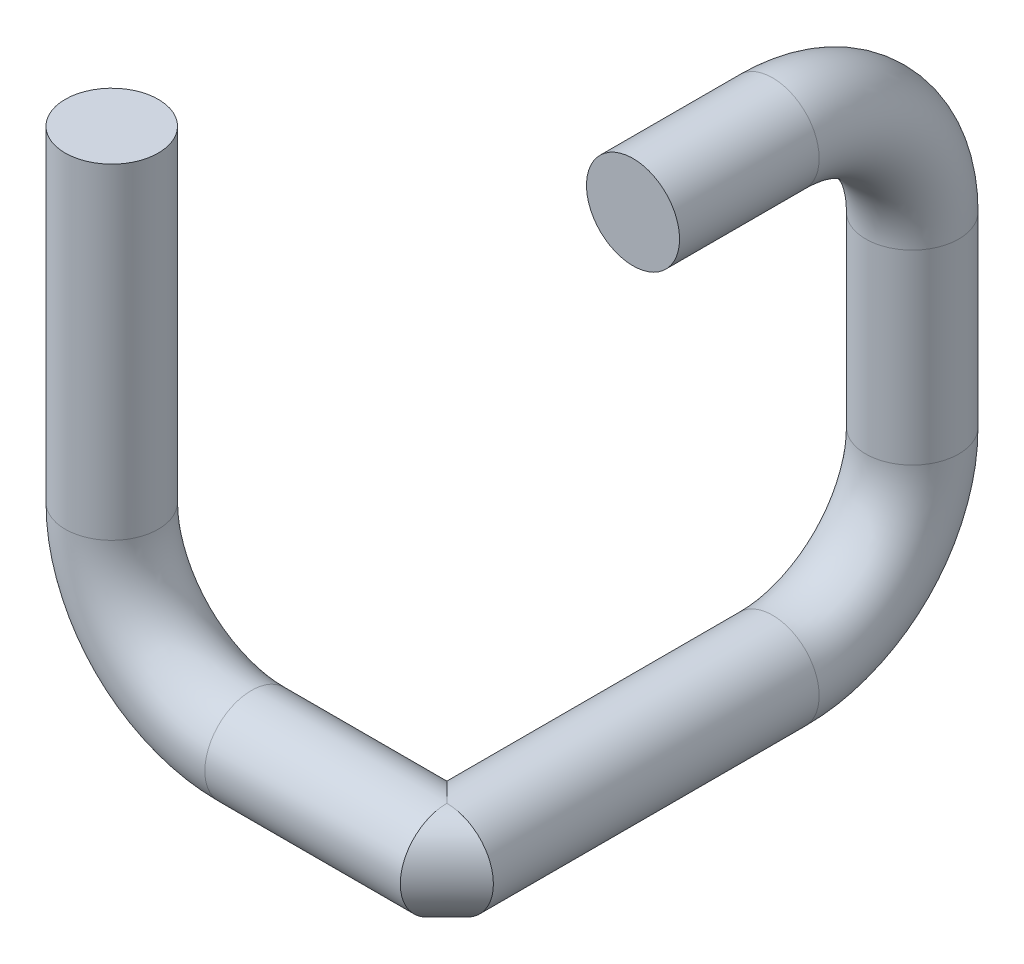
ISO-10303-21;
HEADER;
FILE_DESCRIPTION(('STEP AP214'),'2;1');
FILE_NAME('part.step','',(''),(''),'','','');
FILE_SCHEMA(('AUTOMOTIVE_DESIGN { 1 0 10303 214 1 1 1 1 }'));
ENDSEC;
DATA;
#1=APPLICATION_CONTEXT('core data for automotive mechanical design processes');
#2=APPLICATION_PROTOCOL_DEFINITION('international standard','automotive_design',2000,#1);
#3=PRODUCT_CONTEXT('',#1,'mechanical');
#4=PRODUCT('Part','Part','',(#3));
#5=PRODUCT_RELATED_PRODUCT_CATEGORY('part','',(#4));
#6=PRODUCT_DEFINITION_FORMATION('','',#4);
#7=PRODUCT_DEFINITION_CONTEXT('part definition',#1,'design');
#8=PRODUCT_DEFINITION('design','',#6,#7);
#9=PRODUCT_DEFINITION_SHAPE('','',#8);
#10=(LENGTH_UNIT() NAMED_UNIT(*) SI_UNIT(.MILLI.,.METRE.));
#11=(NAMED_UNIT(*) PLANE_ANGLE_UNIT() SI_UNIT($,.RADIAN.));
#12=(NAMED_UNIT(*) SI_UNIT($,.STERADIAN.) SOLID_ANGLE_UNIT());
#13=UNCERTAINTY_MEASURE_WITH_UNIT(LENGTH_MEASURE(1.E-05),#10,'distance_accuracy_value','');
#14=(GEOMETRIC_REPRESENTATION_CONTEXT(3) GLOBAL_UNCERTAINTY_ASSIGNED_CONTEXT((#13)) GLOBAL_UNIT_ASSIGNED_CONTEXT((#10,
#11,#12)) REPRESENTATION_CONTEXT('',''));
#15=CARTESIAN_POINT('',(0.,0.,0.));
#16=DIRECTION('',(0.,0.,1.));
#17=DIRECTION('',(1.,0.,0.));
#18=AXIS2_PLACEMENT_3D('',#15,#16,#17);
#19=CARTESIAN_POINT('',(-36.1538461538461,26.8269230769231,0.));
#20=DIRECTION('',(0.,1.,0.));
#21=DIRECTION('',(0.,0.,1.));
#22=AXIS2_PLACEMENT_3D('',#19,#20,#21);
#23=PLANE('',#22);
#24=CARTESIAN_POINT('',(-36.1538461538461,26.8269230769231,0.));
#25=DIRECTION('',(0.,1.,0.));
#26=DIRECTION('',(0.,0.,1.));
#27=AXIS2_PLACEMENT_3D('',#24,#25,#26);
#28=CIRCLE('',#27,5.);
#29=CARTESIAN_POINT('',(-36.1538461538461,26.8269230769231,5.));
#30=VERTEX_POINT('',#29);
#31=EDGE_CURVE('E170',#30,#30,#28,.T.);
#32=ORIENTED_EDGE('',*,*,#31,.T.);
#33=EDGE_LOOP('',(#32));
#34=FACE_BOUND('',#33,.T.);
#35=ADVANCED_FACE('F39',(#34),#23,.T.);
#36=CARTESIAN_POINT('',(-36.1538461538461,26.8269230769231,0.));
#37=DIRECTION('',(0.,-1.,0.));
#38=DIRECTION('',(0.,0.,-1.));
#39=AXIS2_PLACEMENT_3D('',#36,#37,#38);
#40=CYLINDRICAL_SURFACE('',#39,5.);
#41=CARTESIAN_POINT('',(-36.1538461538461,-8.17307692307681,0.));
#42=DIRECTION('',(0.,1.,0.));
#43=DIRECTION('',(0.,0.,1.));
#44=AXIS2_PLACEMENT_3D('',#41,#42,#43);
#45=CIRCLE('',#44,5.);
#46=CARTESIAN_POINT('',(-41.1538461538463,-8.17307692307678,0.));
#47=VERTEX_POINT('',#46);
#48=EDGE_CURVE('E174',#47,#47,#45,.T.);
#49=ORIENTED_EDGE('',*,*,#48,.T.);
#50=EDGE_LOOP('',(#49));
#51=FACE_BOUND('',#50,.T.);
#52=ORIENTED_EDGE('',*,*,#31,.F.);
#53=EDGE_LOOP('',(#52));
#54=FACE_BOUND('',#53,.T.);
#55=ADVANCED_FACE('F92',(#51,#54),#40,.T.);
#56=CARTESIAN_POINT('',(-21.1538461538461,-8.17307692307692,0.));
#57=DIRECTION('',(0.,0.,1.));
#58=DIRECTION('',(1.,0.,0.));
#59=AXIS2_PLACEMENT_3D('',#56,#57,#58);
#60=TOROIDAL_SURFACE('',#59,15.0000000000002,5.);
#61=CARTESIAN_POINT('',(-21.153846153846,-23.1730769230769,0.));
#62=DIRECTION('',(-1.,0.,0.));
#63=DIRECTION('',(0.,0.,1.));
#64=AXIS2_PLACEMENT_3D('',#61,#62,#63);
#65=CIRCLE('',#64,5.);
#66=CARTESIAN_POINT('',(-21.153846153846,-28.1730769230771,0.));
#67=VERTEX_POINT('',#66);
#68=EDGE_CURVE('E73',#67,#67,#65,.T.);
#69=CARTESIAN_POINT('',(-21.1538461538461,-8.17307692307692,0.));
#70=DIRECTION('',(0.,0.,1.));
#71=DIRECTION('',(1.,0.,0.));
#72=AXIS2_PLACEMENT_3D('',#69,#70,#71);
#73=CIRCLE('',#72,20.0000000000002);
#74=EDGE_CURVE('',#47,#67,#73,.T.);
#75=ORIENTED_EDGE('',*,*,#48,.F.);
#76=ORIENTED_EDGE('',*,*,#68,.T.);
#77=ORIENTED_EDGE('',*,*,#74,.T.);
#78=ORIENTED_EDGE('',*,*,#74,.F.);
#79=EDGE_LOOP('',(#75,#77,#76,#78));
#80=FACE_BOUND('',#79,.T.);
#81=ADVANCED_FACE('F89',(#80),#60,.T.);
#82=CARTESIAN_POINT('',(-21.153846153846,-23.1730769230769,0.));
#83=DIRECTION('',(1.,0.,0.));
#84=DIRECTION('',(0.,0.,-1.));
#85=AXIS2_PLACEMENT_3D('',#82,#83,#84);
#86=CYLINDRICAL_SURFACE('',#85,5.);
#87=CARTESIAN_POINT('',(-0.15384615384615,-23.1730769230769,0.));
#88=DIRECTION('',(-1.,0.,0.));
#89=DIRECTION('',(0.,0.,1.));
#90=AXIS2_PLACEMENT_3D('',#87,#88,#89);
#91=CIRCLE('',#90,5.);
#92=CARTESIAN_POINT('',(-0.15384615384615,-28.1730769230769,0.));
#93=VERTEX_POINT('',#92);
#94=CARTESIAN_POINT('',(-0.15384615384615,-18.1730769230769,0.));
#95=VERTEX_POINT('',#94);
#96=EDGE_CURVE('E42',#93,#95,#91,.T.);
#97=ORIENTED_EDGE('',*,*,#96,.T.);
#98=CARTESIAN_POINT('',(-0.15384615384615,-23.1730769230769,0.));
#99=DIRECTION('',(0.707106781186547,0.,-0.707106781186547));
#100=DIRECTION('',(0.707106781186547,0.,0.707106781186547));
#101=AXIS2_PLACEMENT_3D('',#98,#99,#100);
#102=ELLIPSE('',#101,7.07106781186548,5.);
#103=EDGE_CURVE('E11',#95,#93,#102,.F.);
#104=ORIENTED_EDGE('',*,*,#103,.T.);
#105=EDGE_LOOP('',(#97,#104));
#106=FACE_BOUND('',#105,.T.);
#107=ORIENTED_EDGE('',*,*,#68,.F.);
#108=EDGE_LOOP('',(#107));
#109=FACE_BOUND('',#108,.T.);
#110=ADVANCED_FACE('F70',(#106,#109),#86,.T.);
#111=CARTESIAN_POINT('',(-0.15384615384615,-23.1730769230769,0.));
#112=DIRECTION('',(0.,0.,-1.));
#113=DIRECTION('',(-1.,0.,0.));
#114=AXIS2_PLACEMENT_3D('',#111,#112,#113);
#115=CYLINDRICAL_SURFACE('',#114,5.);
#116=CARTESIAN_POINT('',(-0.15384615384615,-23.1730769230769,-34.9999999999999));
#117=DIRECTION('',(0.,0.,-1.));
#118=DIRECTION('',(1.,0.,0.));
#119=AXIS2_PLACEMENT_3D('',#116,#117,#118);
#120=CIRCLE('',#119,5.);
#121=CARTESIAN_POINT('',(-0.15384615384615,-28.1730769230769,-34.9999999999999));
#122=VERTEX_POINT('',#121);
#123=EDGE_CURVE('E64',#122,#122,#120,.T.);
#124=ORIENTED_EDGE('',*,*,#123,.F.);
#125=EDGE_LOOP('',(#124));
#126=FACE_BOUND('',#125,.T.);
#127=ORIENTED_EDGE('',*,*,#103,.F.);
#128=CARTESIAN_POINT('',(-0.15384615384615,-23.1730769230769,0.));
#129=DIRECTION('',(0.,0.,-1.));
#130=DIRECTION('',(1.,0.,0.));
#131=AXIS2_PLACEMENT_3D('',#128,#129,#130);
#132=CIRCLE('',#131,5.);
#133=EDGE_CURVE('E57',#95,#93,#132,.T.);
#134=ORIENTED_EDGE('',*,*,#133,.T.);
#135=EDGE_LOOP('',(#127,#134));
#136=FACE_BOUND('',#135,.T.);
#137=ADVANCED_FACE('F67',(#126,#136),#115,.T.);
#138=CARTESIAN_POINT('',(-0.15384615384615,26.8269230769231,-20.));
#139=DIRECTION('',(0.,0.,1.));
#140=DIRECTION('',(1.,0.,0.));
#141=AXIS2_PLACEMENT_3D('',#138,#139,#140);
#142=PLANE('',#141);
#143=CARTESIAN_POINT('',(-0.15384615384615,26.8269230769231,-20.));
#144=DIRECTION('',(0.,0.,1.));
#145=DIRECTION('',(1.,0.,0.));
#146=AXIS2_PLACEMENT_3D('',#143,#144,#145);
#147=CIRCLE('',#146,5.);
#148=CARTESIAN_POINT('',(4.84615384615385,26.8269230769231,-20.));
#149=VERTEX_POINT('',#148);
#150=EDGE_CURVE('E166',#149,#149,#147,.T.);
#151=ORIENTED_EDGE('',*,*,#150,.T.);
#152=EDGE_LOOP('',(#151));
#153=FACE_BOUND('',#152,.T.);
#154=ADVANCED_FACE('F97',(#153),#142,.T.);
#155=CARTESIAN_POINT('',(-0.15384615384615,-8.17307692307692,-35.));
#156=DIRECTION('',(1.,0.,0.));
#157=DIRECTION('',(0.,0.,-1.));
#158=AXIS2_PLACEMENT_3D('',#155,#156,#157);
#159=TOROIDAL_SURFACE('',#158,15.,5.);
#160=CARTESIAN_POINT('',(-0.15384615384615,-8.17307692307682,-50.));
#161=DIRECTION('',(0.,1.,0.));
#162=DIRECTION('',(1.,0.,0.));
#163=AXIS2_PLACEMENT_3D('',#160,#161,#162);
#164=CIRCLE('',#163,5.);
#165=CARTESIAN_POINT('',(-0.15384615384615,-8.17307692307678,-55.));
#166=VERTEX_POINT('',#165);
#167=EDGE_CURVE('E154',#166,#166,#164,.T.);
#168=CARTESIAN_POINT('',(-0.15384615384615,-8.17307692307692,-35.));
#169=DIRECTION('',(1.,0.,0.));
#170=DIRECTION('',(0.,0.,-1.));
#171=AXIS2_PLACEMENT_3D('',#168,#169,#170);
#172=CIRCLE('',#171,20.);
#173=EDGE_CURVE('',#122,#166,#172,.T.);
#174=ORIENTED_EDGE('',*,*,#123,.T.);
#175=ORIENTED_EDGE('',*,*,#167,.F.);
#176=ORIENTED_EDGE('',*,*,#173,.T.);
#177=ORIENTED_EDGE('',*,*,#173,.F.);
#178=EDGE_LOOP('',(#174,#176,#175,#177));
#179=FACE_BOUND('',#178,.T.);
#180=ADVANCED_FACE('F100',(#179),#159,.T.);
#181=CARTESIAN_POINT('',(-0.15384615384615,-8.17307692307681,-50.));
#182=DIRECTION('',(0.,1.,0.));
#183=DIRECTION('',(0.,0.,1.));
#184=AXIS2_PLACEMENT_3D('',#181,#182,#183);
#185=CYLINDRICAL_SURFACE('',#184,5.);
#186=CARTESIAN_POINT('',(-0.15384615384615,11.8269230769231,-50.));
#187=DIRECTION('',(0.,1.,0.));
#188=DIRECTION('',(1.,0.,0.));
#189=AXIS2_PLACEMENT_3D('',#186,#187,#188);
#190=CIRCLE('',#189,5.);
#191=CARTESIAN_POINT('',(-0.15384615384615,11.8269230769231,-55.));
#192=VERTEX_POINT('',#191);
#193=EDGE_CURVE('E158',#192,#192,#190,.T.);
#194=ORIENTED_EDGE('',*,*,#193,.F.);
#195=EDGE_LOOP('',(#194));
#196=FACE_BOUND('',#195,.T.);
#197=ORIENTED_EDGE('',*,*,#167,.T.);
#198=EDGE_LOOP('',(#197));
#199=FACE_BOUND('',#198,.T.);
#200=ADVANCED_FACE('F109',(#196,#199),#185,.T.);
#201=CARTESIAN_POINT('',(-0.15384615384615,11.8269230769231,-35.));
#202=DIRECTION('',(1.,0.,0.));
#203=DIRECTION('',(0.,0.,-1.));
#204=AXIS2_PLACEMENT_3D('',#201,#202,#203);
#205=TOROIDAL_SURFACE('',#204,15.,5.);
#206=CARTESIAN_POINT('',(-0.15384615384615,26.8269230769231,-35.));
#207=DIRECTION('',(0.,0.,1.));
#208=DIRECTION('',(1.,0.,0.));
#209=AXIS2_PLACEMENT_3D('',#206,#207,#208);
#210=CIRCLE('',#209,5.);
#211=CARTESIAN_POINT('',(-0.15384615384615,31.8269230769231,-35.));
#212=VERTEX_POINT('',#211);
#213=EDGE_CURVE('E162',#212,#212,#210,.T.);
#214=CARTESIAN_POINT('',(-0.15384615384615,11.8269230769231,-35.));
#215=DIRECTION('',(1.,0.,0.));
#216=DIRECTION('',(0.,0.,-1.));
#217=AXIS2_PLACEMENT_3D('',#214,#215,#216);
#218=CIRCLE('',#217,20.);
#219=EDGE_CURVE('',#192,#212,#218,.T.);
#220=ORIENTED_EDGE('',*,*,#193,.T.);
#221=ORIENTED_EDGE('',*,*,#213,.F.);
#222=ORIENTED_EDGE('',*,*,#219,.T.);
#223=ORIENTED_EDGE('',*,*,#219,.F.);
#224=EDGE_LOOP('',(#220,#222,#221,#223));
#225=FACE_BOUND('',#224,.T.);
#226=ADVANCED_FACE('F105',(#225),#205,.T.);
#227=CARTESIAN_POINT('',(-0.15384615384615,26.8269230769231,-35.));
#228=DIRECTION('',(0.,0.,1.));
#229=DIRECTION('',(0.,-1.,0.));
#230=AXIS2_PLACEMENT_3D('',#227,#228,#229);
#231=CYLINDRICAL_SURFACE('',#230,5.);
#232=ORIENTED_EDGE('',*,*,#150,.F.);
#233=EDGE_LOOP('',(#232));
#234=FACE_BOUND('',#233,.T.);
#235=ORIENTED_EDGE('',*,*,#213,.T.);
#236=EDGE_LOOP('',(#235));
#237=FACE_BOUND('',#236,.T.);
#238=ADVANCED_FACE('F102',(#234,#237),#231,.T.);
#239=CARTESIAN_POINT('',(-0.15384615384615,-18.1730769230769,0.));
#240=CARTESIAN_POINT('',(-0.153846153846151,-18.1730769230769,0.));
#241=CARTESIAN_POINT('',(-0.15384615384615,-18.1730769230769,0.416666666666667));
#242=CARTESIAN_POINT('',(0.262820512820516,-18.1730769230769,0.));
#243=CARTESIAN_POINT('',(-0.15384615384615,-18.2237435897436,0.888000000000001));
#244=CARTESIAN_POINT('',(0.734153846153849,-18.2237435897436,0.));
#245=CARTESIAN_POINT('',(-0.15384615384615,-18.4477435897436,1.656));
#246=CARTESIAN_POINT('',(1.50215384615385,-18.4477435897436,0.));
#247=CARTESIAN_POINT('',(-0.15384615384615,-18.5473983471395,1.92168497243614));
#248=CARTESIAN_POINT('',(1.76783881858999,-18.5473983471395,0.));
#249=CARTESIAN_POINT('',(-0.15384615384615,-18.8099914540705,2.46033749947397));
#250=CARTESIAN_POINT('',(2.30649134562782,-18.8099914540705,0.));
#251=CARTESIAN_POINT('',(-0.15384615384615,-18.9730769230769,2.73333333333334));
#252=CARTESIAN_POINT('',(2.57948717948718,-18.9730769230769,0.));
#253=CARTESIAN_POINT('',(-0.15384615384615,-19.3730769230769,3.26666666666667));
#254=CARTESIAN_POINT('',(3.11282051282052,-19.3730769230769,0.));
#255=CARTESIAN_POINT('',(-0.15384615384615,-19.6101820710096,3.5269281291049));
#256=CARTESIAN_POINT('',(3.37308197525875,-19.6101820710096,0.));
#257=CARTESIAN_POINT('',(-0.15384615384615,-20.1606293093908,4.00731844623757));
#258=CARTESIAN_POINT('',(3.85347229239142,-20.1606293093908,0.));
#259=CARTESIAN_POINT('',(-0.15384615384615,-20.4741149853607,4.22722029988466));
#260=CARTESIAN_POINT('',(4.07337414603851,-20.4741149853607,0.));
#261=CARTESIAN_POINT('',(-0.15384615384615,-21.166156507852,4.59630911188005));
#262=CARTESIAN_POINT('',(4.44246295803389,-21.166156507852,0.));
#263=CARTESIAN_POINT('',(-0.15384615384615,-21.544674556213,4.74516765285996));
#264=CARTESIAN_POINT('',(4.59132149901381,-21.544674556213,0.));
#265=CARTESIAN_POINT('',(-0.15384615384615,-22.3399408284024,4.94714003944774));
#266=CARTESIAN_POINT('',(4.79329388560158,-22.3399408284024,0.));
#267=CARTESIAN_POINT('',(-0.15384615384615,-22.7564102564102,5.));
#268=CARTESIAN_POINT('',(4.84615384615385,-22.7564102564103,0.));
#269=CARTESIAN_POINT('',(-0.15384615384615,-23.5897435897436,5.));
#270=CARTESIAN_POINT('',(4.84615384615385,-23.5897435897436,0.));
#271=CARTESIAN_POINT('',(-0.15384615384615,-24.0062130177515,4.94714003944774));
#272=CARTESIAN_POINT('',(4.79329388560158,-24.0062130177515,0.));
#273=CARTESIAN_POINT('',(-0.15384615384615,-24.8014792899408,4.74516765285996));
#274=CARTESIAN_POINT('',(4.59132149901381,-24.8014792899408,0.));
#275=CARTESIAN_POINT('',(-0.15384615384615,-25.1799973383018,4.59630911188005));
#276=CARTESIAN_POINT('',(4.4424629580339,-25.1799973383018,0.));
#277=CARTESIAN_POINT('',(-0.15384615384615,-25.8720388607932,4.22722029988466));
#278=CARTESIAN_POINT('',(4.07337414603851,-25.8720388607932,0.));
#279=CARTESIAN_POINT('',(-0.15384615384615,-26.185524536763,4.00731844623757));
#280=CARTESIAN_POINT('',(3.85347229239142,-26.185524536763,0.));
#281=CARTESIAN_POINT('',(-0.15384615384615,-26.7359717751442,3.5269281291049));
#282=CARTESIAN_POINT('',(3.37308197525875,-26.7359717751442,0.));
#283=CARTESIAN_POINT('',(-0.15384615384615,-26.9730769230769,3.26666666666667));
#284=CARTESIAN_POINT('',(3.11282051282052,-26.9730769230769,0.));
#285=CARTESIAN_POINT('',(-0.15384615384615,-27.3730769230769,2.73333333333333));
#286=CARTESIAN_POINT('',(2.57948717948718,-27.3730769230769,0.));
#287=CARTESIAN_POINT('',(-0.15384615384615,-27.5361623920834,2.46033749947397));
#288=CARTESIAN_POINT('',(2.30649134562782,-27.5361623920834,0.));
#289=CARTESIAN_POINT('',(-0.15384615384615,-27.7987554990143,1.92168497243614));
#290=CARTESIAN_POINT('',(1.76783881858999,-27.7987554990143,0.));
#291=CARTESIAN_POINT('',(-0.15384615384615,-27.8984102564102,1.656));
#292=CARTESIAN_POINT('',(1.50215384615385,-27.8984102564103,0.));
#293=CARTESIAN_POINT('',(-0.15384615384615,-28.1224102564103,0.888000000000001));
#294=CARTESIAN_POINT('',(0.734153846153849,-28.1224102564103,0.));
#295=CARTESIAN_POINT('',(-0.15384615384615,-28.1730769230769,0.416666666666666));
#296=CARTESIAN_POINT('',(0.262820512820517,-28.1730769230769,0.));
#297=CARTESIAN_POINT('',(-0.15384615384615,-28.1730769230769,0.));
#298=CARTESIAN_POINT('',(-0.153846153846148,-28.1730769230769,0.));
#299=B_SPLINE_SURFACE_WITH_KNOTS('',3,1,((#239,#240),(#241,#242),(#243,#244),(#245,#246),(#247,
#248),(#249,#250),(#251,#252),(#253,#254),(#255,#256),(#257,#258),(#259,#260),(#261,#262),(#263,
#264),(#265,#266),(#267,#268),(#269,#270),(#271,#272),(#273,#274),(#275,#276),(#277,#278),(#279,
#280),(#281,#282),(#283,#284),(#285,#286),(#287,#288),(#289,#290),(#291,#292),(#293,#294),(#295,
#296),(#297,#298)),.UNSPECIFIED.,.F.,.F.,.F.,(4,2,2,2,2,2,2,2,2,2,2,2,2,2,4),(2,2),(0.,0.125,
0.1875,0.25,0.3125,0.375,0.4375,0.5,0.5625,0.625,0.6875,0.75,0.8125,0.875,1.),(0.,1.),.UNSPECIFIED.);
#300=ORIENTED_EDGE('',*,*,#96,.F.);
#301=ORIENTED_EDGE('',*,*,#133,.F.);
#302=EDGE_LOOP('',(#300,#301));
#303=FACE_BOUND('',#302,.T.);
#304=ADVANCED_FACE('F60',(#303),#299,.T.);
#305=CLOSED_SHELL('',(#35,#55,#81,#110,#137,#154,#180,#200,#226,#238,#304));
#306=MANIFOLD_SOLID_BREP('B2',#305);
#307=ADVANCED_BREP_SHAPE_REPRESENTATION('',(#18,#306),#14);
#308=SHAPE_DEFINITION_REPRESENTATION(#9,#307);
ENDSEC;
END-ISO-10303-21;
